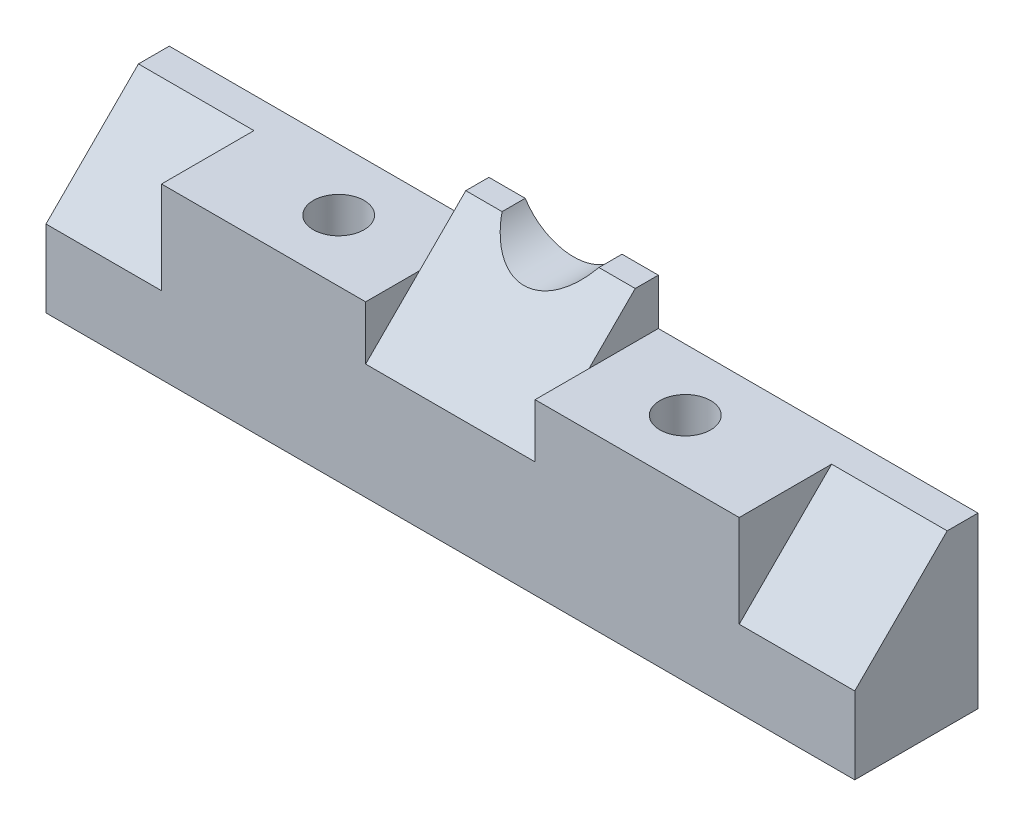
ISO-10303-21;
HEADER;
FILE_DESCRIPTION(('STEP AP214'),'2;1');
FILE_NAME('part.step','',(''),(''),'','','');
FILE_SCHEMA(('AUTOMOTIVE_DESIGN { 1 0 10303 214 1 1 1 1 }'));
ENDSEC;
DATA;
#1=APPLICATION_CONTEXT('core data for automotive mechanical design processes');
#2=APPLICATION_PROTOCOL_DEFINITION('international standard','automotive_design',2000,#1);
#3=PRODUCT_CONTEXT('',#1,'mechanical');
#4=PRODUCT('Part','Part','',(#3));
#5=PRODUCT_RELATED_PRODUCT_CATEGORY('part','',(#4));
#6=PRODUCT_DEFINITION_FORMATION('','',#4);
#7=PRODUCT_DEFINITION_CONTEXT('part definition',#1,'design');
#8=PRODUCT_DEFINITION('design','',#6,#7);
#9=PRODUCT_DEFINITION_SHAPE('','',#8);
#10=(LENGTH_UNIT() NAMED_UNIT(*) SI_UNIT(.MILLI.,.METRE.));
#11=(NAMED_UNIT(*) PLANE_ANGLE_UNIT() SI_UNIT($,.RADIAN.));
#12=(NAMED_UNIT(*) SI_UNIT($,.STERADIAN.) SOLID_ANGLE_UNIT());
#13=UNCERTAINTY_MEASURE_WITH_UNIT(LENGTH_MEASURE(1.E-05),#10,'distance_accuracy_value','');
#14=(GEOMETRIC_REPRESENTATION_CONTEXT(3) GLOBAL_UNCERTAINTY_ASSIGNED_CONTEXT((#13)) GLOBAL_UNIT_ASSIGNED_CONTEXT((#10,
#11,#12)) REPRESENTATION_CONTEXT('',''));
#15=CARTESIAN_POINT('',(0.,0.,0.));
#16=DIRECTION('',(0.,0.,1.));
#17=DIRECTION('',(1.,0.,0.));
#18=AXIS2_PLACEMENT_3D('',#15,#16,#17);
#19=CARTESIAN_POINT('',(84.1155281280884,28.0000000000001,3.));
#20=DIRECTION('',(0.,-1.,0.));
#21=DIRECTION('',(1.,0.,0.));
#22=AXIS2_PLACEMENT_3D('',#19,#20,#21);
#23=PLANE('',#22);
#24=DIRECTION('',(-1.,0.,0.));
#25=VECTOR('',#24,1.);
#26=CARTESIAN_POINT('',(84.1155281280884,28.0000000000001,3.));
#27=LINE('',#26,#25);
#28=CARTESIAN_POINT('',(46.2148985688376,28.0000000000001,3.));
#29=VERTEX_POINT('',#28);
#30=CARTESIAN_POINT('',(41.5,28.0000000000001,3.));
#31=VERTEX_POINT('',#30);
#32=EDGE_CURVE('E182',#29,#31,#27,.T.);
#33=ORIENTED_EDGE('',*,*,#32,.F.);
#34=DIRECTION('',(0.,0.,-1.));
#35=VECTOR('',#34,1.);
#36=CARTESIAN_POINT('',(46.2148985688376,28.0000000000001,15.));
#37=LINE('',#36,#35);
#38=CARTESIAN_POINT('',(46.2148985688376,28.0000000000001,0.));
#39=VERTEX_POINT('',#38);
#40=EDGE_CURVE('E57',#29,#39,#37,.T.);
#41=ORIENTED_EDGE('',*,*,#40,.T.);
#42=DIRECTION('',(-1.,0.,0.));
#43=VECTOR('',#42,1.);
#44=CARTESIAN_POINT('',(84.1155281280884,28.0000000000001,0.));
#45=LINE('',#44,#43);
#46=CARTESIAN_POINT('',(41.5,28.0000000000001,0.));
#47=VERTEX_POINT('',#46);
#48=EDGE_CURVE('E168',#39,#47,#45,.T.);
#49=ORIENTED_EDGE('',*,*,#48,.T.);
#50=DIRECTION('',(0.,0.,1.));
#51=VECTOR('',#50,1.);
#52=CARTESIAN_POINT('',(41.5,28.0000000000001,3.));
#53=LINE('',#52,#51);
#54=EDGE_CURVE('E177',#47,#31,#53,.T.);
#55=ORIENTED_EDGE('',*,*,#54,.T.);
#56=EDGE_LOOP('',(#33,#41,#49,#55));
#57=FACE_BOUND('',#56,.T.);
#58=ADVANCED_FACE('F39',(#57),#23,.F.);
#59=CARTESIAN_POINT('',(41.5,15.,0.));
#60=DIRECTION('',(-1.,0.,0.));
#61=DIRECTION('',(0.,0.,1.));
#62=AXIS2_PLACEMENT_3D('',#59,#60,#61);
#63=PLANE('',#62);
#64=DIRECTION('',(0.,-0.707106781186551,0.707106781186544));
#65=VECTOR('',#64,1.);
#66=CARTESIAN_POINT('',(41.5,15.,16.));
#67=LINE('',#66,#65);
#68=CARTESIAN_POINT('',(41.5,22.,9.00000000000008));
#69=VERTEX_POINT('',#68);
#70=CARTESIAN_POINT('',(41.5,15.,16.));
#71=VERTEX_POINT('',#70);
#72=EDGE_CURVE('E64',#69,#71,#67,.T.);
#73=ORIENTED_EDGE('',*,*,#72,.F.);
#74=DIRECTION('',(0.,0.,-1.));
#75=VECTOR('',#74,1.);
#76=CARTESIAN_POINT('',(41.5,22.,16.));
#77=LINE('',#76,#75);
#78=CARTESIAN_POINT('',(41.5,22.,16.));
#79=VERTEX_POINT('',#78);
#80=EDGE_CURVE('E212',#79,#69,#77,.T.);
#81=ORIENTED_EDGE('',*,*,#80,.F.);
#82=DIRECTION('',(0.,-1.,0.));
#83=VECTOR('',#82,1.);
#84=CARTESIAN_POINT('',(41.5,15.,16.));
#85=LINE('',#84,#83);
#86=EDGE_CURVE('E196',#79,#71,#85,.T.);
#87=ORIENTED_EDGE('',*,*,#86,.T.);
#88=EDGE_LOOP('',(#73,#81,#87));
#89=FACE_BOUND('',#88,.T.);
#90=ADVANCED_FACE('F394',(#89),#63,.F.);
#91=CARTESIAN_POINT('',(63.5,15.,0.));
#92=DIRECTION('',(1.,0.,0.));
#93=DIRECTION('',(0.,0.,-1.));
#94=AXIS2_PLACEMENT_3D('',#91,#92,#93);
#95=PLANE('',#94);
#96=DIRECTION('',(0.,-0.707106781186551,0.707106781186544));
#97=VECTOR('',#96,1.);
#98=CARTESIAN_POINT('',(63.5,15.,16.));
#99=LINE('',#98,#97);
#100=CARTESIAN_POINT('',(63.5,22.,9.00000000000006));
#101=VERTEX_POINT('',#100);
#102=CARTESIAN_POINT('',(63.5,15.,16.));
#103=VERTEX_POINT('',#102);
#104=EDGE_CURVE('E324',#101,#103,#99,.T.);
#105=ORIENTED_EDGE('',*,*,#104,.T.);
#106=DIRECTION('',(0.,1.,0.));
#107=VECTOR('',#106,1.);
#108=CARTESIAN_POINT('',(63.5,15.,16.));
#109=LINE('',#108,#107);
#110=CARTESIAN_POINT('',(63.5,22.,16.));
#111=VERTEX_POINT('',#110);
#112=EDGE_CURVE('E203',#103,#111,#109,.T.);
#113=ORIENTED_EDGE('',*,*,#112,.T.);
#114=DIRECTION('',(0.,0.,1.));
#115=VECTOR('',#114,1.);
#116=CARTESIAN_POINT('',(63.5,22.,16.));
#117=LINE('',#116,#115);
#118=EDGE_CURVE('E207',#101,#111,#117,.T.);
#119=ORIENTED_EDGE('',*,*,#118,.F.);
#120=EDGE_LOOP('',(#105,#113,#119));
#121=FACE_BOUND('',#120,.T.);
#122=ADVANCED_FACE('F340',(#121),#95,.F.);
#123=CARTESIAN_POINT('',(0.,22.,16.));
#124=DIRECTION('',(0.,-1.,0.));
#125=DIRECTION('',(0.,0.,-1.));
#126=AXIS2_PLACEMENT_3D('',#123,#124,#125);
#127=PLANE('',#126);
#128=CARTESIAN_POINT('',(30.,22.,8.));
#129=DIRECTION('',(0.,-1.,0.));
#130=DIRECTION('',(0.,0.,-1.));
#131=AXIS2_PLACEMENT_3D('',#128,#129,#130);
#132=CIRCLE('',#131,3.29999999999999);
#133=CARTESIAN_POINT('',(30.,22.,4.70000000000001));
#134=VERTEX_POINT('',#133);
#135=EDGE_CURVE('E43',#134,#134,#132,.T.);
#136=ORIENTED_EDGE('',*,*,#135,.T.);
#137=EDGE_LOOP('',(#136));
#138=FACE_BOUND('',#137,.T.);
#139=DIRECTION('',(-1.,0.,0.));
#140=VECTOR('',#139,1.);
#141=CARTESIAN_POINT('',(0.,22.,16.));
#142=LINE('',#141,#140);
#143=CARTESIAN_POINT('',(15.,22.,16.));
#144=VERTEX_POINT('',#143);
#145=EDGE_CURVE('E271',#79,#144,#142,.T.);
#146=ORIENTED_EDGE('',*,*,#145,.F.);
#147=ORIENTED_EDGE('',*,*,#80,.T.);
#148=DIRECTION('',(0.,0.,1.));
#149=VECTOR('',#148,1.);
#150=CARTESIAN_POINT('',(41.5,22.,16.));
#151=LINE('',#150,#149);
#152=CARTESIAN_POINT('',(41.5,22.,0.));
#153=VERTEX_POINT('',#152);
#154=EDGE_CURVE('E192',#153,#69,#151,.T.);
#155=ORIENTED_EDGE('',*,*,#154,.F.);
#156=DIRECTION('',(-1.,0.,0.));
#157=VECTOR('',#156,1.);
#158=CARTESIAN_POINT('',(0.,22.,0.));
#159=LINE('',#158,#157);
#160=CARTESIAN_POINT('',(0.,22.,0.));
#161=VERTEX_POINT('',#160);
#162=EDGE_CURVE('E287',#153,#161,#159,.T.);
#163=ORIENTED_EDGE('',*,*,#162,.T.);
#164=DIRECTION('',(0.,0.,-1.));
#165=VECTOR('',#164,1.);
#166=CARTESIAN_POINT('',(0.,22.,16.));
#167=LINE('',#166,#165);
#168=CARTESIAN_POINT('',(0.,22.,4.));
#169=VERTEX_POINT('',#168);
#170=EDGE_CURVE('E276',#169,#161,#167,.T.);
#171=ORIENTED_EDGE('',*,*,#170,.F.);
#172=DIRECTION('',(-1.,0.,0.));
#173=VECTOR('',#172,1.);
#174=CARTESIAN_POINT('',(15.,22.,4.));
#175=LINE('',#174,#173);
#176=CARTESIAN_POINT('',(15.,22.,4.));
#177=VERTEX_POINT('',#176);
#178=EDGE_CURVE('E235',#177,#169,#175,.T.);
#179=ORIENTED_EDGE('',*,*,#178,.F.);
#180=DIRECTION('',(0.,0.,1.));
#181=VECTOR('',#180,1.);
#182=CARTESIAN_POINT('',(15.,22.,16.));
#183=LINE('',#182,#181);
#184=EDGE_CURVE('E220',#177,#144,#183,.T.);
#185=ORIENTED_EDGE('',*,*,#184,.T.);
#186=EDGE_LOOP('',(#146,#147,#155,#163,#171,#179,#185));
#187=FACE_BOUND('',#186,.T.);
#188=ADVANCED_FACE('F363',(#138,#187),#127,.F.);
#189=CARTESIAN_POINT('',(0.,0.,16.));
#190=DIRECTION('',(1.,0.,0.));
#191=DIRECTION('',(0.,0.,-1.));
#192=AXIS2_PLACEMENT_3D('',#189,#190,#191);
#193=PLANE('',#192);
#194=DIRECTION('',(0.,0.707106781186544,-0.707106781186551));
#195=VECTOR('',#194,1.);
#196=CARTESIAN_POINT('',(0.,5.00000000000011,21.0000000000001));
#197=LINE('',#196,#195);
#198=CARTESIAN_POINT('',(0.,10.0000000000001,16.));
#199=VERTEX_POINT('',#198);
#200=EDGE_CURVE('E215',#199,#169,#197,.T.);
#201=ORIENTED_EDGE('',*,*,#200,.T.);
#202=ORIENTED_EDGE('',*,*,#170,.T.);
#203=DIRECTION('',(0.,-1.,0.));
#204=VECTOR('',#203,1.);
#205=CARTESIAN_POINT('',(0.,0.,0.));
#206=LINE('',#205,#204);
#207=CARTESIAN_POINT('',(0.,0.,0.));
#208=VERTEX_POINT('',#207);
#209=EDGE_CURVE('E256',#161,#208,#206,.T.);
#210=ORIENTED_EDGE('',*,*,#209,.T.);
#211=DIRECTION('',(0.,0.,-1.));
#212=VECTOR('',#211,1.);
#213=CARTESIAN_POINT('',(0.,0.,16.));
#214=LINE('',#213,#212);
#215=CARTESIAN_POINT('',(0.,0.,16.));
#216=VERTEX_POINT('',#215);
#217=EDGE_CURVE('E49',#216,#208,#214,.T.);
#218=ORIENTED_EDGE('',*,*,#217,.F.);
#219=DIRECTION('',(0.,-1.,0.));
#220=VECTOR('',#219,1.);
#221=CARTESIAN_POINT('',(0.,0.,16.));
#222=LINE('',#221,#220);
#223=EDGE_CURVE('E260',#199,#216,#222,.T.);
#224=ORIENTED_EDGE('',*,*,#223,.F.);
#225=EDGE_LOOP('',(#201,#202,#210,#218,#224));
#226=FACE_BOUND('',#225,.T.);
#227=ADVANCED_FACE('F41',(#226),#193,.F.);
#228=CARTESIAN_POINT('',(75.,22.,8.));
#229=DIRECTION('',(0.,-1.,0.));
#230=DIRECTION('',(0.,0.,-1.));
#231=AXIS2_PLACEMENT_3D('',#228,#229,#230);
#232=CIRCLE('',#231,3.3);
#233=CARTESIAN_POINT('',(75.,22.,4.70000000000001));
#234=VERTEX_POINT('',#233);
#235=EDGE_CURVE('E170',#234,#234,#232,.T.);
#236=ORIENTED_EDGE('',*,*,#235,.T.);
#237=EDGE_LOOP('',(#236));
#238=FACE_BOUND('',#237,.T.);
#239=CARTESIAN_POINT('',(105.,22.,0.));
#240=VERTEX_POINT('',#239);
#241=CARTESIAN_POINT('',(63.5,22.,0.));
#242=VERTEX_POINT('',#241);
#243=EDGE_CURVE('E264',#240,#242,#159,.T.);
#244=ORIENTED_EDGE('',*,*,#243,.T.);
#245=EDGE_CURVE('E208',#242,#101,#117,.T.);
#246=ORIENTED_EDGE('',*,*,#245,.T.);
#247=ORIENTED_EDGE('',*,*,#118,.T.);
#248=CARTESIAN_POINT('',(90.,22.,16.));
#249=VERTEX_POINT('',#248);
#250=EDGE_CURVE('E272',#249,#111,#142,.T.);
#251=ORIENTED_EDGE('',*,*,#250,.F.);
#252=DIRECTION('',(0.,0.,1.));
#253=VECTOR('',#252,1.);
#254=CARTESIAN_POINT('',(90.,22.,16.));
#255=LINE('',#254,#253);
#256=CARTESIAN_POINT('',(90.,22.,4.));
#257=VERTEX_POINT('',#256);
#258=EDGE_CURVE('E243',#257,#249,#255,.T.);
#259=ORIENTED_EDGE('',*,*,#258,.F.);
#260=DIRECTION('',(1.,0.,0.));
#261=VECTOR('',#260,1.);
#262=CARTESIAN_POINT('',(90.,22.,4.));
#263=LINE('',#262,#261);
#264=CARTESIAN_POINT('',(105.,22.,4.));
#265=VERTEX_POINT('',#264);
#266=EDGE_CURVE('E250',#257,#265,#263,.T.);
#267=ORIENTED_EDGE('',*,*,#266,.T.);
#268=DIRECTION('',(0.,0.,-1.));
#269=VECTOR('',#268,1.);
#270=CARTESIAN_POINT('',(105.,22.,16.));
#271=LINE('',#270,#269);
#272=EDGE_CURVE('E293',#265,#240,#271,.T.);
#273=ORIENTED_EDGE('',*,*,#272,.T.);
#274=EDGE_LOOP('',(#244,#246,#247,#251,#259,#267,#273));
#275=FACE_BOUND('',#274,.T.);
#276=ADVANCED_FACE('F353',(#238,#275),#127,.F.);
#277=CARTESIAN_POINT('',(0.,0.,16.));
#278=DIRECTION('',(0.,0.,-1.));
#279=DIRECTION('',(-1.,0.,0.));
#280=AXIS2_PLACEMENT_3D('',#277,#278,#279);
#281=PLANE('',#280);
#282=DIRECTION('',(1.,0.,0.));
#283=VECTOR('',#282,1.);
#284=CARTESIAN_POINT('',(63.5,15.,16.));
#285=LINE('',#284,#283);
#286=EDGE_CURVE('E199',#71,#103,#285,.T.);
#287=ORIENTED_EDGE('',*,*,#286,.F.);
#288=ORIENTED_EDGE('',*,*,#86,.F.);
#289=ORIENTED_EDGE('',*,*,#145,.T.);
#290=DIRECTION('',(0.,-1.,0.));
#291=VECTOR('',#290,1.);
#292=CARTESIAN_POINT('',(15.,0.,16.));
#293=LINE('',#292,#291);
#294=CARTESIAN_POINT('',(15.,10.0000000000001,16.));
#295=VERTEX_POINT('',#294);
#296=EDGE_CURVE('E224',#144,#295,#293,.T.);
#297=ORIENTED_EDGE('',*,*,#296,.T.);
#298=DIRECTION('',(-1.,0.,0.));
#299=VECTOR('',#298,1.);
#300=CARTESIAN_POINT('',(15.,10.0000000000001,16.));
#301=LINE('',#300,#299);
#302=EDGE_CURVE('E228',#295,#199,#301,.T.);
#303=ORIENTED_EDGE('',*,*,#302,.T.);
#304=ORIENTED_EDGE('',*,*,#223,.T.);
#305=DIRECTION('',(1.,0.,0.));
#306=VECTOR('',#305,1.);
#307=CARTESIAN_POINT('',(0.,0.,16.));
#308=LINE('',#307,#306);
#309=CARTESIAN_POINT('',(105.,0.,16.));
#310=VERTEX_POINT('',#309);
#311=EDGE_CURVE('E263',#216,#310,#308,.T.);
#312=ORIENTED_EDGE('',*,*,#311,.T.);
#313=DIRECTION('',(0.,1.,0.));
#314=VECTOR('',#313,1.);
#315=CARTESIAN_POINT('',(105.,0.,16.));
#316=LINE('',#315,#314);
#317=CARTESIAN_POINT('',(105.,10.0000000000001,16.));
#318=VERTEX_POINT('',#317);
#319=EDGE_CURVE('E267',#310,#318,#316,.T.);
#320=ORIENTED_EDGE('',*,*,#319,.T.);
#321=DIRECTION('',(1.,0.,0.));
#322=VECTOR('',#321,1.);
#323=CARTESIAN_POINT('',(90.,10.0000000000001,16.));
#324=LINE('',#323,#322);
#325=CARTESIAN_POINT('',(90.,10.0000000000001,16.));
#326=VERTEX_POINT('',#325);
#327=EDGE_CURVE('E253',#326,#318,#324,.T.);
#328=ORIENTED_EDGE('',*,*,#327,.F.);
#329=DIRECTION('',(0.,-1.,0.));
#330=VECTOR('',#329,1.);
#331=CARTESIAN_POINT('',(90.,10.0000000000001,16.));
#332=LINE('',#331,#330);
#333=EDGE_CURVE('E246',#249,#326,#332,.T.);
#334=ORIENTED_EDGE('',*,*,#333,.F.);
#335=ORIENTED_EDGE('',*,*,#250,.T.);
#336=ORIENTED_EDGE('',*,*,#112,.F.);
#337=EDGE_LOOP('',(#287,#288,#289,#297,#303,#304,#312,#320,#328,#334,#335,#336));
#338=FACE_BOUND('',#337,.T.);
#339=ADVANCED_FACE('F346',(#338),#281,.F.);
#340=CARTESIAN_POINT('',(0.,0.,16.));
#341=DIRECTION('',(0.,1.,0.));
#342=DIRECTION('',(0.,0.,1.));
#343=AXIS2_PLACEMENT_3D('',#340,#341,#342);
#344=PLANE('',#343);
#345=CARTESIAN_POINT('',(30.,0.,8.));
#346=DIRECTION('',(0.,-1.,0.));
#347=DIRECTION('',(0.,0.,-1.));
#348=AXIS2_PLACEMENT_3D('',#345,#346,#347);
#349=CIRCLE('',#348,5.525);
#350=CARTESIAN_POINT('',(30.,0.,2.475));
#351=VERTEX_POINT('',#350);
#352=EDGE_CURVE('E588',#351,#351,#349,.T.);
#353=ORIENTED_EDGE('',*,*,#352,.F.);
#354=EDGE_LOOP('',(#353));
#355=FACE_BOUND('',#354,.T.);
#356=CARTESIAN_POINT('',(75.,0.,8.));
#357=DIRECTION('',(0.,-1.,0.));
#358=DIRECTION('',(0.,0.,-1.));
#359=AXIS2_PLACEMENT_3D('',#356,#357,#358);
#360=CIRCLE('',#359,5.525);
#361=CARTESIAN_POINT('',(75.,0.,2.475));
#362=VERTEX_POINT('',#361);
#363=EDGE_CURVE('E602',#362,#362,#360,.T.);
#364=ORIENTED_EDGE('',*,*,#363,.F.);
#365=EDGE_LOOP('',(#364));
#366=FACE_BOUND('',#365,.T.);
#367=DIRECTION('',(1.,0.,0.));
#368=VECTOR('',#367,1.);
#369=CARTESIAN_POINT('',(0.,0.,0.));
#370=LINE('',#369,#368);
#371=CARTESIAN_POINT('',(105.,0.,0.));
#372=VERTEX_POINT('',#371);
#373=EDGE_CURVE('E280',#208,#372,#370,.T.);
#374=ORIENTED_EDGE('',*,*,#373,.T.);
#375=DIRECTION('',(0.,0.,-1.));
#376=VECTOR('',#375,1.);
#377=CARTESIAN_POINT('',(105.,0.,16.));
#378=LINE('',#377,#376);
#379=EDGE_CURVE('E296',#310,#372,#378,.T.);
#380=ORIENTED_EDGE('',*,*,#379,.F.);
#381=ORIENTED_EDGE('',*,*,#311,.F.);
#382=ORIENTED_EDGE('',*,*,#217,.T.);
#383=EDGE_LOOP('',(#374,#380,#381,#382));
#384=FACE_BOUND('',#383,.T.);
#385=ADVANCED_FACE('F374',(#355,#366,#384),#344,.F.);
#386=CARTESIAN_POINT('',(105.,0.,16.));
#387=DIRECTION('',(-1.,0.,0.));
#388=DIRECTION('',(0.,0.,1.));
#389=AXIS2_PLACEMENT_3D('',#386,#387,#388);
#390=PLANE('',#389);
#391=ORIENTED_EDGE('',*,*,#272,.F.);
#392=DIRECTION('',(0.,0.707106781186544,-0.707106781186551));
#393=VECTOR('',#392,1.);
#394=CARTESIAN_POINT('',(105.,10.0000000000001,16.));
#395=LINE('',#394,#393);
#396=EDGE_CURVE('E238',#318,#265,#395,.T.);
#397=ORIENTED_EDGE('',*,*,#396,.F.);
#398=ORIENTED_EDGE('',*,*,#319,.F.);
#399=ORIENTED_EDGE('',*,*,#379,.T.);
#400=DIRECTION('',(0.,1.,0.));
#401=VECTOR('',#400,1.);
#402=CARTESIAN_POINT('',(105.,0.,0.));
#403=LINE('',#402,#401);
#404=EDGE_CURVE('E283',#372,#240,#403,.T.);
#405=ORIENTED_EDGE('',*,*,#404,.T.);
#406=EDGE_LOOP('',(#391,#397,#398,#399,#405));
#407=FACE_BOUND('',#406,.T.);
#408=ADVANCED_FACE('F380',(#407),#390,.F.);
#409=CARTESIAN_POINT('',(0.,0.,0.));
#410=DIRECTION('',(0.,0.,-1.));
#411=DIRECTION('',(-1.,0.,0.));
#412=AXIS2_PLACEMENT_3D('',#409,#410,#411);
#413=PLANE('',#412);
#414=CARTESIAN_POINT('',(52.5,32.0000000000001,0.));
#415=DIRECTION('',(0.,0.,-1.));
#416=DIRECTION('',(-1.,0.,0.));
#417=AXIS2_PLACEMENT_3D('',#414,#415,#416);
#418=CIRCLE('',#417,7.45);
#419=CARTESIAN_POINT('',(58.7851014311624,28.0000000000001,0.));
#420=VERTEX_POINT('',#419);
#421=EDGE_CURVE('E155',#420,#39,#418,.T.);
#422=ORIENTED_EDGE('',*,*,#421,.F.);
#423=CARTESIAN_POINT('',(63.5,28.0000000000001,0.));
#424=VERTEX_POINT('',#423);
#425=EDGE_CURVE('E166',#424,#420,#45,.T.);
#426=ORIENTED_EDGE('',*,*,#425,.F.);
#427=DIRECTION('',(0.,1.,0.));
#428=VECTOR('',#427,1.);
#429=CARTESIAN_POINT('',(63.5,28.0000000000001,0.));
#430=LINE('',#429,#428);
#431=EDGE_CURVE('E329',#242,#424,#430,.T.);
#432=ORIENTED_EDGE('',*,*,#431,.F.);
#433=ORIENTED_EDGE('',*,*,#243,.F.);
#434=ORIENTED_EDGE('',*,*,#404,.F.);
#435=ORIENTED_EDGE('',*,*,#373,.F.);
#436=ORIENTED_EDGE('',*,*,#209,.F.);
#437=ORIENTED_EDGE('',*,*,#162,.F.);
#438=DIRECTION('',(0.,1.,0.));
#439=VECTOR('',#438,1.);
#440=CARTESIAN_POINT('',(41.5,28.0000000000001,0.));
#441=LINE('',#440,#439);
#442=EDGE_CURVE('E184',#153,#47,#441,.T.);
#443=ORIENTED_EDGE('',*,*,#442,.T.);
#444=ORIENTED_EDGE('',*,*,#48,.F.);
#445=EDGE_LOOP('',(#422,#426,#432,#433,#434,#435,#436,#437,#443,#444));
#446=FACE_BOUND('',#445,.T.);
#447=ADVANCED_FACE('F164',(#446),#413,.T.);
#448=CARTESIAN_POINT('',(90.,10.0000000000001,16.));
#449=DIRECTION('',(0.,-0.707106781186551,-0.707106781186544));
#450=DIRECTION('',(0.,0.707106781186544,-0.707106781186551));
#451=AXIS2_PLACEMENT_3D('',#448,#449,#450);
#452=PLANE('',#451);
#453=ORIENTED_EDGE('',*,*,#396,.T.);
#454=ORIENTED_EDGE('',*,*,#266,.F.);
#455=DIRECTION('',(0.,0.707106781186544,-0.707106781186551));
#456=VECTOR('',#455,1.);
#457=CARTESIAN_POINT('',(90.,10.0000000000001,16.));
#458=LINE('',#457,#456);
#459=EDGE_CURVE('E239',#326,#257,#458,.T.);
#460=ORIENTED_EDGE('',*,*,#459,.F.);
#461=ORIENTED_EDGE('',*,*,#327,.T.);
#462=EDGE_LOOP('',(#453,#454,#460,#461));
#463=FACE_BOUND('',#462,.T.);
#464=ADVANCED_FACE('F382',(#463),#452,.F.);
#465=CARTESIAN_POINT('',(90.,0.,0.));
#466=DIRECTION('',(-1.,0.,0.));
#467=DIRECTION('',(0.,0.,1.));
#468=AXIS2_PLACEMENT_3D('',#465,#466,#467);
#469=PLANE('',#468);
#470=ORIENTED_EDGE('',*,*,#459,.T.);
#471=ORIENTED_EDGE('',*,*,#258,.T.);
#472=ORIENTED_EDGE('',*,*,#333,.T.);
#473=EDGE_LOOP('',(#470,#471,#472));
#474=FACE_BOUND('',#473,.T.);
#475=ADVANCED_FACE('F384',(#474),#469,.F.);
#476=CARTESIAN_POINT('',(15.,5.00000000000011,21.0000000000001));
#477=DIRECTION('',(0.,0.707106781186551,0.707106781186544));
#478=DIRECTION('',(0.,-0.707106781186544,0.707106781186551));
#479=AXIS2_PLACEMENT_3D('',#476,#477,#478);
#480=PLANE('',#479);
#481=ORIENTED_EDGE('',*,*,#200,.F.);
#482=ORIENTED_EDGE('',*,*,#302,.F.);
#483=DIRECTION('',(0.,0.707106781186544,-0.707106781186551));
#484=VECTOR('',#483,1.);
#485=CARTESIAN_POINT('',(15.,5.00000000000011,21.0000000000001));
#486=LINE('',#485,#484);
#487=EDGE_CURVE('E216',#295,#177,#486,.T.);
#488=ORIENTED_EDGE('',*,*,#487,.T.);
#489=ORIENTED_EDGE('',*,*,#178,.T.);
#490=EDGE_LOOP('',(#481,#482,#488,#489));
#491=FACE_BOUND('',#490,.T.);
#492=ADVANCED_FACE('F366',(#491),#480,.T.);
#493=CARTESIAN_POINT('',(15.,0.,0.));
#494=DIRECTION('',(1.,0.,0.));
#495=DIRECTION('',(0.,0.,-1.));
#496=AXIS2_PLACEMENT_3D('',#493,#494,#495);
#497=PLANE('',#496);
#498=ORIENTED_EDGE('',*,*,#487,.F.);
#499=ORIENTED_EDGE('',*,*,#296,.F.);
#500=ORIENTED_EDGE('',*,*,#184,.F.);
#501=EDGE_LOOP('',(#498,#499,#500));
#502=FACE_BOUND('',#501,.T.);
#503=ADVANCED_FACE('F360',(#502),#497,.F.);
#504=CARTESIAN_POINT('',(41.5,0.,0.));
#505=DIRECTION('',(1.,0.,0.));
#506=DIRECTION('',(0.,1.,0.));
#507=AXIS2_PLACEMENT_3D('',#504,#505,#506);
#508=PLANE('',#507);
#509=ORIENTED_EDGE('',*,*,#442,.F.);
#510=ORIENTED_EDGE('',*,*,#154,.T.);
#511=EDGE_CURVE('E321',#31,#69,#67,.T.);
#512=ORIENTED_EDGE('',*,*,#511,.F.);
#513=ORIENTED_EDGE('',*,*,#54,.F.);
#514=EDGE_LOOP('',(#509,#510,#512,#513));
#515=FACE_BOUND('',#514,.T.);
#516=ADVANCED_FACE('F410',(#515),#508,.F.);
#517=CARTESIAN_POINT('',(63.5,15.,0.));
#518=DIRECTION('',(1.,0.,0.));
#519=DIRECTION('',(0.,0.,-1.));
#520=AXIS2_PLACEMENT_3D('',#517,#518,#519);
#521=PLANE('',#520);
#522=ORIENTED_EDGE('',*,*,#245,.F.);
#523=ORIENTED_EDGE('',*,*,#431,.T.);
#524=DIRECTION('',(0.,0.,1.));
#525=VECTOR('',#524,1.);
#526=CARTESIAN_POINT('',(63.5,28.0000000000001,3.));
#527=LINE('',#526,#525);
#528=CARTESIAN_POINT('',(63.5,28.0000000000001,3.));
#529=VERTEX_POINT('',#528);
#530=EDGE_CURVE('E175',#424,#529,#527,.T.);
#531=ORIENTED_EDGE('',*,*,#530,.T.);
#532=EDGE_CURVE('E187',#529,#101,#99,.T.);
#533=ORIENTED_EDGE('',*,*,#532,.T.);
#534=EDGE_LOOP('',(#522,#523,#531,#533));
#535=FACE_BOUND('',#534,.T.);
#536=ADVANCED_FACE('F405',(#535),#521,.T.);
#537=ORIENTED_EDGE('',*,*,#425,.T.);
#538=DIRECTION('',(0.,0.,-1.));
#539=VECTOR('',#538,1.);
#540=CARTESIAN_POINT('',(58.7851014311624,28.0000000000001,15.));
#541=LINE('',#540,#539);
#542=CARTESIAN_POINT('',(58.7851014311624,28.0000000000001,3.));
#543=VERTEX_POINT('',#542);
#544=EDGE_CURVE('E152',#420,#543,#541,.F.);
#545=ORIENTED_EDGE('',*,*,#544,.T.);
#546=EDGE_CURVE('E189',#529,#543,#27,.T.);
#547=ORIENTED_EDGE('',*,*,#546,.F.);
#548=ORIENTED_EDGE('',*,*,#530,.F.);
#549=EDGE_LOOP('',(#537,#545,#547,#548));
#550=FACE_BOUND('',#549,.T.);
#551=ADVANCED_FACE('F173',(#550),#23,.F.);
#552=CARTESIAN_POINT('',(84.1155281280884,15.,16.));
#553=DIRECTION('',(0.,-0.707106781186544,-0.707106781186552));
#554=DIRECTION('',(0.,0.707106781186551,-0.707106781186544));
#555=AXIS2_PLACEMENT_3D('',#552,#553,#554);
#556=PLANE('',#555);
#557=ORIENTED_EDGE('',*,*,#546,.T.);
#558=CARTESIAN_POINT('',(52.5,32.0000000000001,-0.999999999999942));
#559=DIRECTION('',(0.,-0.707106781186544,-0.707106781186552));
#560=DIRECTION('',(0.,0.707106781186551,-0.707106781186544));
#561=AXIS2_PLACEMENT_3D('',#558,#559,#560);
#562=ELLIPSE('',#561,10.5358910396795,7.45);
#563=EDGE_CURVE('E11',#543,#29,#562,.T.);
#564=ORIENTED_EDGE('',*,*,#563,.T.);
#565=ORIENTED_EDGE('',*,*,#32,.T.);
#566=ORIENTED_EDGE('',*,*,#511,.T.);
#567=ORIENTED_EDGE('',*,*,#72,.T.);
#568=ORIENTED_EDGE('',*,*,#286,.T.);
#569=ORIENTED_EDGE('',*,*,#104,.F.);
#570=ORIENTED_EDGE('',*,*,#532,.F.);
#571=EDGE_LOOP('',(#557,#564,#565,#566,#567,#568,#569,#570));
#572=FACE_BOUND('',#571,.T.);
#573=ADVANCED_FACE('F343',(#572),#556,.F.);
#574=CARTESIAN_POINT('',(52.5,32.0000000000001,15.));
#575=DIRECTION('',(0.,0.,-1.));
#576=DIRECTION('',(-1.,0.,0.));
#577=AXIS2_PLACEMENT_3D('',#574,#575,#576);
#578=CYLINDRICAL_SURFACE('',#577,7.45);
#579=ORIENTED_EDGE('',*,*,#563,.F.);
#580=ORIENTED_EDGE('',*,*,#544,.F.);
#581=ORIENTED_EDGE('',*,*,#421,.T.);
#582=ORIENTED_EDGE('',*,*,#40,.F.);
#583=EDGE_LOOP('',(#579,#580,#581,#582));
#584=FACE_BOUND('',#583,.T.);
#585=ADVANCED_FACE('F154',(#584),#578,.F.);
#586=CARTESIAN_POINT('',(75.,0.,8.));
#587=DIRECTION('',(0.,-1.,0.));
#588=DIRECTION('',(0.,0.,-1.));
#589=AXIS2_PLACEMENT_3D('',#586,#587,#588);
#590=CYLINDRICAL_SURFACE('',#589,3.3);
#591=CARTESIAN_POINT('',(75.,5.99999999999999,8.));
#592=DIRECTION('',(0.,-1.,0.));
#593=DIRECTION('',(0.,0.,-1.));
#594=AXIS2_PLACEMENT_3D('',#591,#592,#593);
#595=CIRCLE('',#594,3.3);
#596=CARTESIAN_POINT('',(75.,5.99999999999999,4.70000000000001));
#597=VERTEX_POINT('',#596);
#598=EDGE_CURVE('E304',#597,#597,#595,.T.);
#599=ORIENTED_EDGE('',*,*,#598,.T.);
#600=EDGE_LOOP('',(#599));
#601=FACE_BOUND('',#600,.T.);
#602=ORIENTED_EDGE('',*,*,#235,.F.);
#603=EDGE_LOOP('',(#602));
#604=FACE_BOUND('',#603,.T.);
#605=ADVANCED_FACE('F472',(#601,#604),#590,.F.);
#606=CARTESIAN_POINT('',(80.5,5.99999999999999,8.));
#607=DIRECTION('',(0.,1.,0.));
#608=DIRECTION('',(0.,0.,1.));
#609=AXIS2_PLACEMENT_3D('',#606,#607,#608);
#610=PLANE('',#609);
#611=ORIENTED_EDGE('',*,*,#598,.F.);
#612=EDGE_LOOP('',(#611));
#613=FACE_BOUND('',#612,.T.);
#614=CARTESIAN_POINT('',(75.,5.99999999999999,8.));
#615=DIRECTION('',(0.,-1.,0.));
#616=DIRECTION('',(0.,0.,-1.));
#617=AXIS2_PLACEMENT_3D('',#614,#615,#616);
#618=CIRCLE('',#617,5.49999999999999);
#619=CARTESIAN_POINT('',(75.,5.99999999999999,2.50000000000001));
#620=VERTEX_POINT('',#619);
#621=EDGE_CURVE('E309',#620,#620,#618,.T.);
#622=ORIENTED_EDGE('',*,*,#621,.T.);
#623=EDGE_LOOP('',(#622));
#624=FACE_BOUND('',#623,.T.);
#625=ADVANCED_FACE('F509',(#613,#624),#610,.F.);
#626=CARTESIAN_POINT('',(75.,0.,8.));
#627=DIRECTION('',(0.,-1.,0.));
#628=DIRECTION('',(0.,0.,-1.));
#629=AXIS2_PLACEMENT_3D('',#626,#627,#628);
#630=CYLINDRICAL_SURFACE('',#629,5.49999999999999);
#631=ORIENTED_EDGE('',*,*,#621,.F.);
#632=EDGE_LOOP('',(#631));
#633=FACE_BOUND('',#632,.T.);
#634=CARTESIAN_POINT('',(75.,0.0250000000000034,8.));
#635=DIRECTION('',(0.,-1.,0.));
#636=DIRECTION('',(0.,0.,-1.));
#637=AXIS2_PLACEMENT_3D('',#634,#635,#636);
#638=CIRCLE('',#637,5.49999999999999);
#639=CARTESIAN_POINT('',(75.,0.0250000000000034,2.50000000000001));
#640=VERTEX_POINT('',#639);
#641=EDGE_CURVE('E315',#640,#640,#638,.T.);
#642=ORIENTED_EDGE('',*,*,#641,.T.);
#643=EDGE_LOOP('',(#642));
#644=FACE_BOUND('',#643,.T.);
#645=ADVANCED_FACE('F518',(#633,#644),#630,.F.);
#646=CARTESIAN_POINT('',(75.,0.,8.));
#647=DIRECTION('',(0.,-1.,0.));
#648=DIRECTION('',(0.,0.,-1.));
#649=AXIS2_PLACEMENT_3D('',#646,#647,#648);
#650=CONICAL_SURFACE('',#649,5.525,0.785398163397551);
#651=ORIENTED_EDGE('',*,*,#641,.F.);
#652=EDGE_LOOP('',(#651));
#653=FACE_BOUND('',#652,.T.);
#654=ORIENTED_EDGE('',*,*,#363,.T.);
#655=EDGE_LOOP('',(#654));
#656=FACE_BOUND('',#655,.T.);
#657=ADVANCED_FACE('F528',(#653,#656),#650,.F.);
#658=CARTESIAN_POINT('',(30.,0.,8.));
#659=DIRECTION('',(0.,-1.,0.));
#660=DIRECTION('',(0.,0.,-1.));
#661=AXIS2_PLACEMENT_3D('',#658,#659,#660);
#662=CYLINDRICAL_SURFACE('',#661,3.29999999999999);
#663=CARTESIAN_POINT('',(30.,5.99999999999999,8.));
#664=DIRECTION('',(0.,-1.,0.));
#665=DIRECTION('',(0.,0.,-1.));
#666=AXIS2_PLACEMENT_3D('',#663,#664,#665);
#667=CIRCLE('',#666,3.3);
#668=CARTESIAN_POINT('',(30.,5.99999999999999,4.7));
#669=VERTEX_POINT('',#668);
#670=EDGE_CURVE('E598',#669,#669,#667,.T.);
#671=ORIENTED_EDGE('',*,*,#670,.T.);
#672=EDGE_LOOP('',(#671));
#673=FACE_BOUND('',#672,.T.);
#674=ORIENTED_EDGE('',*,*,#135,.F.);
#675=EDGE_LOOP('',(#674));
#676=FACE_BOUND('',#675,.T.);
#677=ADVANCED_FACE('F538',(#673,#676),#662,.F.);
#678=CARTESIAN_POINT('',(35.5,5.99999999999999,8.));
#679=DIRECTION('',(0.,1.,0.));
#680=DIRECTION('',(0.,0.,1.));
#681=AXIS2_PLACEMENT_3D('',#678,#679,#680);
#682=PLANE('',#681);
#683=ORIENTED_EDGE('',*,*,#670,.F.);
#684=EDGE_LOOP('',(#683));
#685=FACE_BOUND('',#684,.T.);
#686=CARTESIAN_POINT('',(30.,5.99999999999999,8.));
#687=DIRECTION('',(0.,-1.,0.));
#688=DIRECTION('',(0.,0.,-1.));
#689=AXIS2_PLACEMENT_3D('',#686,#687,#688);
#690=CIRCLE('',#689,5.5);
#691=CARTESIAN_POINT('',(30.,5.99999999999999,2.5));
#692=VERTEX_POINT('',#691);
#693=EDGE_CURVE('E592',#692,#692,#690,.T.);
#694=ORIENTED_EDGE('',*,*,#693,.T.);
#695=EDGE_LOOP('',(#694));
#696=FACE_BOUND('',#695,.T.);
#697=ADVANCED_FACE('F548',(#685,#696),#682,.F.);
#698=CARTESIAN_POINT('',(30.,0.,8.));
#699=DIRECTION('',(0.,-1.,0.));
#700=DIRECTION('',(0.,0.,-1.));
#701=AXIS2_PLACEMENT_3D('',#698,#699,#700);
#702=CYLINDRICAL_SURFACE('',#701,5.5);
#703=ORIENTED_EDGE('',*,*,#693,.F.);
#704=EDGE_LOOP('',(#703));
#705=FACE_BOUND('',#704,.T.);
#706=CARTESIAN_POINT('',(30.,0.0250000000000034,8.));
#707=DIRECTION('',(0.,-1.,0.));
#708=DIRECTION('',(0.,0.,-1.));
#709=AXIS2_PLACEMENT_3D('',#706,#707,#708);
#710=CIRCLE('',#709,5.5);
#711=CARTESIAN_POINT('',(30.,0.0250000000000034,2.5));
#712=VERTEX_POINT('',#711);
#713=EDGE_CURVE('E585',#712,#712,#710,.T.);
#714=ORIENTED_EDGE('',*,*,#713,.T.);
#715=EDGE_LOOP('',(#714));
#716=FACE_BOUND('',#715,.T.);
#717=ADVANCED_FACE('F558',(#705,#716),#702,.F.);
#718=CARTESIAN_POINT('',(30.,0.,8.));
#719=DIRECTION('',(0.,-1.,0.));
#720=DIRECTION('',(0.,0.,-1.));
#721=AXIS2_PLACEMENT_3D('',#718,#719,#720);
#722=CONICAL_SURFACE('',#721,5.525,0.785398163397412);
#723=ORIENTED_EDGE('',*,*,#713,.F.);
#724=EDGE_LOOP('',(#723));
#725=FACE_BOUND('',#724,.T.);
#726=ORIENTED_EDGE('',*,*,#352,.T.);
#727=EDGE_LOOP('',(#726));
#728=FACE_BOUND('',#727,.T.);
#729=ADVANCED_FACE('F568',(#725,#728),#722,.F.);
#730=CLOSED_SHELL('',(#58,#90,#122,#188,#227,#276,#339,#385,#408,#447,#464,#475,#492,#503,#516,
#536,#551,#573,#585,#605,#625,#645,#657,#677,#697,#717,#729));
#731=MANIFOLD_SOLID_BREP('B2',#730);
#732=ADVANCED_BREP_SHAPE_REPRESENTATION('',(#18,#731),#14);
#733=SHAPE_DEFINITION_REPRESENTATION(#9,#732);
ENDSEC;
END-ISO-10303-21;
